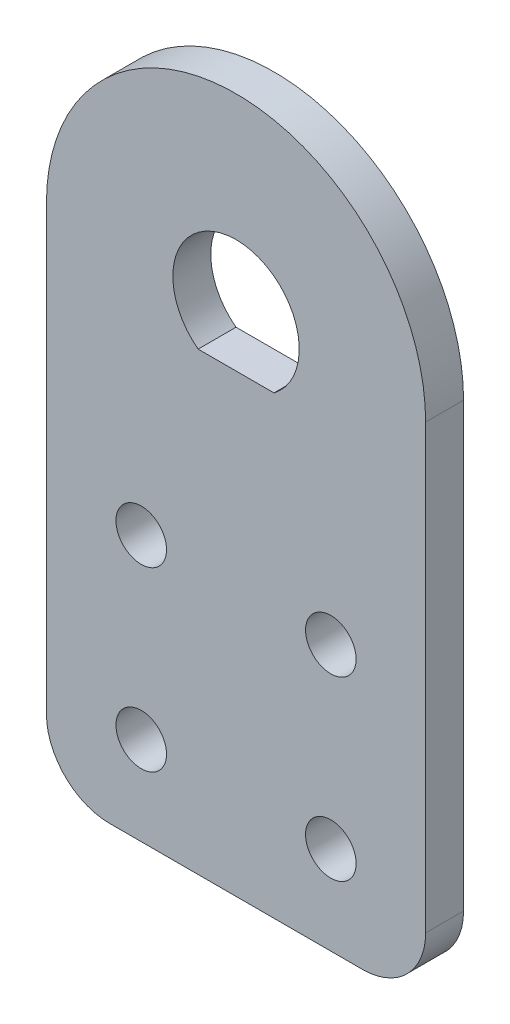
ISO-10303-21;
HEADER;
FILE_DESCRIPTION(('STEP AP214'),'2;1');
FILE_NAME('part.step','',(''),(''),'','','');
FILE_SCHEMA(('AUTOMOTIVE_DESIGN { 1 0 10303 214 1 1 1 1 }'));
ENDSEC;
DATA;
#1=APPLICATION_CONTEXT('core data for automotive mechanical design processes');
#2=APPLICATION_PROTOCOL_DEFINITION('international standard','automotive_design',2000,#1);
#3=PRODUCT_CONTEXT('',#1,'mechanical');
#4=PRODUCT('Part','Part','',(#3));
#5=PRODUCT_RELATED_PRODUCT_CATEGORY('part','',(#4));
#6=PRODUCT_DEFINITION_FORMATION('','',#4);
#7=PRODUCT_DEFINITION_CONTEXT('part definition',#1,'design');
#8=PRODUCT_DEFINITION('design','',#6,#7);
#9=PRODUCT_DEFINITION_SHAPE('','',#8);
#10=(LENGTH_UNIT() NAMED_UNIT(*) SI_UNIT(.MILLI.,.METRE.));
#11=(NAMED_UNIT(*) PLANE_ANGLE_UNIT() SI_UNIT($,.RADIAN.));
#12=(NAMED_UNIT(*) SI_UNIT($,.STERADIAN.) SOLID_ANGLE_UNIT());
#13=UNCERTAINTY_MEASURE_WITH_UNIT(LENGTH_MEASURE(1.E-05),#10,'distance_accuracy_value','');
#14=(GEOMETRIC_REPRESENTATION_CONTEXT(3) GLOBAL_UNCERTAINTY_ASSIGNED_CONTEXT((#13)) GLOBAL_UNIT_ASSIGNED_CONTEXT((#10,
#11,#12)) REPRESENTATION_CONTEXT('',''));
#15=CARTESIAN_POINT('',(0.,0.,0.));
#16=DIRECTION('',(0.,0.,1.));
#17=DIRECTION('',(1.,0.,0.));
#18=AXIS2_PLACEMENT_3D('',#15,#16,#17);
#19=CARTESIAN_POINT('',(0.,9.3667504192892,3.));
#20=DIRECTION('',(0.,0.,1.));
#21=DIRECTION('',(1.,0.,0.));
#22=AXIS2_PLACEMENT_3D('',#19,#20,#21);
#23=PLANE('',#22);
#24=CARTESIAN_POINT('',(7.5,-23.6332495807108,3.));
#25=DIRECTION('',(0.,0.,1.));
#26=DIRECTION('',(-1.,0.,0.));
#27=AXIS2_PLACEMENT_3D('',#24,#25,#26);
#28=CIRCLE('',#27,2.);
#29=CARTESIAN_POINT('',(5.5,-23.6332495807108,3.));
#30=VERTEX_POINT('',#29);
#31=EDGE_CURVE('E143',#30,#30,#28,.T.);
#32=ORIENTED_EDGE('',*,*,#31,.F.);
#33=EDGE_LOOP('',(#32));
#34=FACE_BOUND('',#33,.T.);
#35=CARTESIAN_POINT('',(-7.5,-9.6332495807108,3.));
#36=DIRECTION('',(0.,0.,1.));
#37=DIRECTION('',(1.,0.,0.));
#38=AXIS2_PLACEMENT_3D('',#35,#36,#37);
#39=CIRCLE('',#38,2.);
#40=CARTESIAN_POINT('',(-5.5,-9.6332495807108,3.));
#41=VERTEX_POINT('',#40);
#42=EDGE_CURVE('E159',#41,#41,#39,.T.);
#43=ORIENTED_EDGE('',*,*,#42,.F.);
#44=EDGE_LOOP('',(#43));
#45=FACE_BOUND('',#44,.T.);
#46=DIRECTION('',(1.,0.,0.));
#47=VECTOR('',#46,1.);
#48=CARTESIAN_POINT('',(-15.,-30.6332495807108,3.));
#49=LINE('',#48,#47);
#50=CARTESIAN_POINT('',(-10.,-30.6332495807108,3.));
#51=VERTEX_POINT('',#50);
#52=CARTESIAN_POINT('',(10.,-30.6332495807108,3.));
#53=VERTEX_POINT('',#52);
#54=EDGE_CURVE('E175',#51,#53,#49,.T.);
#55=ORIENTED_EDGE('',*,*,#54,.T.);
#56=CARTESIAN_POINT('',(10.,-25.6332495807108,3.));
#57=DIRECTION('',(0.,0.,1.));
#58=DIRECTION('',(1.,0.,0.));
#59=AXIS2_PLACEMENT_3D('',#56,#57,#58);
#60=CIRCLE('',#59,5.);
#61=CARTESIAN_POINT('',(15.,-25.6332495807108,3.));
#62=VERTEX_POINT('',#61);
#63=EDGE_CURVE('E47',#53,#62,#60,.T.);
#64=ORIENTED_EDGE('',*,*,#63,.T.);
#65=DIRECTION('',(0.,1.,0.));
#66=VECTOR('',#65,1.);
#67=CARTESIAN_POINT('',(15.,-30.6332495807108,3.));
#68=LINE('',#67,#66);
#69=CARTESIAN_POINT('',(15.,9.3667504192892,3.));
#70=VERTEX_POINT('',#69);
#71=EDGE_CURVE('E178',#62,#70,#68,.T.);
#72=ORIENTED_EDGE('',*,*,#71,.T.);
#73=CARTESIAN_POINT('',(0.,9.3667504192892,3.));
#74=DIRECTION('',(0.,0.,1.));
#75=DIRECTION('',(1.,0.,0.));
#76=AXIS2_PLACEMENT_3D('',#73,#74,#75);
#77=CIRCLE('',#76,15.);
#78=CARTESIAN_POINT('',(-15.,9.3667504192892,3.));
#79=VERTEX_POINT('',#78);
#80=EDGE_CURVE('E167',#70,#79,#77,.T.);
#81=ORIENTED_EDGE('',*,*,#80,.T.);
#82=DIRECTION('',(0.,-1.,0.));
#83=VECTOR('',#82,1.);
#84=CARTESIAN_POINT('',(-15.,9.3667504192892,3.));
#85=LINE('',#84,#83);
#86=CARTESIAN_POINT('',(-15.,-25.6332495807108,3.));
#87=VERTEX_POINT('',#86);
#88=EDGE_CURVE('E171',#79,#87,#85,.T.);
#89=ORIENTED_EDGE('',*,*,#88,.T.);
#90=CARTESIAN_POINT('',(-10.,-25.6332495807108,3.));
#91=DIRECTION('',(0.,0.,1.));
#92=DIRECTION('',(1.,0.,0.));
#93=AXIS2_PLACEMENT_3D('',#90,#91,#92);
#94=CIRCLE('',#93,5.);
#95=EDGE_CURVE('E216',#87,#51,#94,.T.);
#96=ORIENTED_EDGE('',*,*,#95,.T.);
#97=EDGE_LOOP('',(#55,#64,#72,#81,#89,#96));
#98=FACE_BOUND('',#97,.T.);
#99=CARTESIAN_POINT('',(-7.5,-23.6332495807108,3.));
#100=DIRECTION('',(0.,0.,1.));
#101=DIRECTION('',(1.,0.,0.));
#102=AXIS2_PLACEMENT_3D('',#99,#100,#101);
#103=CIRCLE('',#102,2.);
#104=CARTESIAN_POINT('',(-5.5,-23.6332495807108,3.));
#105=VERTEX_POINT('',#104);
#106=EDGE_CURVE('E151',#105,#105,#103,.T.);
#107=ORIENTED_EDGE('',*,*,#106,.F.);
#108=EDGE_LOOP('',(#107));
#109=FACE_BOUND('',#108,.T.);
#110=CARTESIAN_POINT('',(7.5,-9.6332495807108,3.));
#111=DIRECTION('',(0.,0.,1.));
#112=DIRECTION('',(-1.,0.,0.));
#113=AXIS2_PLACEMENT_3D('',#110,#111,#112);
#114=CIRCLE('',#113,2.);
#115=CARTESIAN_POINT('',(5.5,-9.6332495807108,3.));
#116=VERTEX_POINT('',#115);
#117=EDGE_CURVE('E135',#116,#116,#114,.T.);
#118=ORIENTED_EDGE('',*,*,#117,.F.);
#119=EDGE_LOOP('',(#118));
#120=FACE_BOUND('',#119,.T.);
#121=DIRECTION('',(1.,0.,0.));
#122=VECTOR('',#121,1.);
#123=CARTESIAN_POINT('',(3.,5.3667504192892,3.));
#124=LINE('',#123,#122);
#125=CARTESIAN_POINT('',(-3.,5.3667504192892,3.));
#126=VERTEX_POINT('',#125);
#127=CARTESIAN_POINT('',(3.,5.3667504192892,3.));
#128=VERTEX_POINT('',#127);
#129=EDGE_CURVE('E105',#126,#128,#124,.T.);
#130=ORIENTED_EDGE('',*,*,#129,.F.);
#131=CARTESIAN_POINT('',(0.,9.3667504192892,3.));
#132=DIRECTION('',(0.,0.,1.));
#133=DIRECTION('',(1.,0.,0.));
#134=AXIS2_PLACEMENT_3D('',#131,#132,#133);
#135=CIRCLE('',#134,5.);
#136=EDGE_CURVE('E116',#128,#126,#135,.T.);
#137=ORIENTED_EDGE('',*,*,#136,.F.);
#138=EDGE_LOOP('',(#130,#137));
#139=FACE_BOUND('',#138,.T.);
#140=ADVANCED_FACE('F38',(#34,#45,#98,#109,#120,#139),#23,.T.);
#141=CARTESIAN_POINT('',(0.,9.3667504192892,0.));
#142=DIRECTION('',(0.,0.,1.));
#143=DIRECTION('',(1.,0.,0.));
#144=AXIS2_PLACEMENT_3D('',#141,#142,#143);
#145=PLANE('',#144);
#146=CARTESIAN_POINT('',(7.5,-9.6332495807108,0.));
#147=DIRECTION('',(0.,0.,1.));
#148=DIRECTION('',(-1.,0.,0.));
#149=AXIS2_PLACEMENT_3D('',#146,#147,#148);
#150=CIRCLE('',#149,2.);
#151=CARTESIAN_POINT('',(5.5,-9.6332495807108,0.));
#152=VERTEX_POINT('',#151);
#153=EDGE_CURVE('E134',#152,#152,#150,.T.);
#154=ORIENTED_EDGE('',*,*,#153,.T.);
#155=EDGE_LOOP('',(#154));
#156=FACE_BOUND('',#155,.T.);
#157=CARTESIAN_POINT('',(7.5,-23.6332495807108,0.));
#158=DIRECTION('',(0.,0.,1.));
#159=DIRECTION('',(-1.,0.,0.));
#160=AXIS2_PLACEMENT_3D('',#157,#158,#159);
#161=CIRCLE('',#160,2.);
#162=CARTESIAN_POINT('',(5.5,-23.6332495807108,0.));
#163=VERTEX_POINT('',#162);
#164=EDGE_CURVE('E139',#163,#163,#161,.T.);
#165=ORIENTED_EDGE('',*,*,#164,.T.);
#166=EDGE_LOOP('',(#165));
#167=FACE_BOUND('',#166,.T.);
#168=CARTESIAN_POINT('',(-7.5,-23.6332495807108,0.));
#169=DIRECTION('',(0.,0.,1.));
#170=DIRECTION('',(1.,0.,0.));
#171=AXIS2_PLACEMENT_3D('',#168,#169,#170);
#172=CIRCLE('',#171,2.);
#173=CARTESIAN_POINT('',(-5.5,-23.6332495807108,0.));
#174=VERTEX_POINT('',#173);
#175=EDGE_CURVE('E147',#174,#174,#172,.T.);
#176=ORIENTED_EDGE('',*,*,#175,.T.);
#177=EDGE_LOOP('',(#176));
#178=FACE_BOUND('',#177,.T.);
#179=CARTESIAN_POINT('',(-7.5,-9.6332495807108,0.));
#180=DIRECTION('',(0.,0.,1.));
#181=DIRECTION('',(1.,0.,0.));
#182=AXIS2_PLACEMENT_3D('',#179,#180,#181);
#183=CIRCLE('',#182,2.);
#184=CARTESIAN_POINT('',(-5.5,-9.6332495807108,0.));
#185=VERTEX_POINT('',#184);
#186=EDGE_CURVE('E155',#185,#185,#183,.T.);
#187=ORIENTED_EDGE('',*,*,#186,.T.);
#188=EDGE_LOOP('',(#187));
#189=FACE_BOUND('',#188,.T.);
#190=DIRECTION('',(0.,1.,0.));
#191=VECTOR('',#190,1.);
#192=CARTESIAN_POINT('',(15.,-30.6332495807108,0.));
#193=LINE('',#192,#191);
#194=CARTESIAN_POINT('',(15.,-25.6332495807108,0.));
#195=VERTEX_POINT('',#194);
#196=CARTESIAN_POINT('',(15.,9.3667504192892,0.));
#197=VERTEX_POINT('',#196);
#198=EDGE_CURVE('E172',#195,#197,#193,.T.);
#199=ORIENTED_EDGE('',*,*,#198,.F.);
#200=CARTESIAN_POINT('',(10.,-25.6332495807108,0.));
#201=DIRECTION('',(0.,0.,1.));
#202=DIRECTION('',(1.,0.,0.));
#203=AXIS2_PLACEMENT_3D('',#200,#201,#202);
#204=CIRCLE('',#203,5.);
#205=CARTESIAN_POINT('',(10.,-30.6332495807108,0.));
#206=VERTEX_POINT('',#205);
#207=EDGE_CURVE('E207',#195,#206,#204,.F.);
#208=ORIENTED_EDGE('',*,*,#207,.T.);
#209=DIRECTION('',(1.,0.,0.));
#210=VECTOR('',#209,1.);
#211=CARTESIAN_POINT('',(-15.,-30.6332495807108,0.));
#212=LINE('',#211,#210);
#213=CARTESIAN_POINT('',(-10.,-30.6332495807108,0.));
#214=VERTEX_POINT('',#213);
#215=EDGE_CURVE('E188',#214,#206,#212,.T.);
#216=ORIENTED_EDGE('',*,*,#215,.F.);
#217=CARTESIAN_POINT('',(-10.,-25.6332495807108,0.));
#218=DIRECTION('',(0.,0.,1.));
#219=DIRECTION('',(1.,0.,0.));
#220=AXIS2_PLACEMENT_3D('',#217,#218,#219);
#221=CIRCLE('',#220,5.);
#222=CARTESIAN_POINT('',(-15.,-25.6332495807108,0.));
#223=VERTEX_POINT('',#222);
#224=EDGE_CURVE('E204',#214,#223,#221,.F.);
#225=ORIENTED_EDGE('',*,*,#224,.T.);
#226=DIRECTION('',(0.,-1.,0.));
#227=VECTOR('',#226,1.);
#228=CARTESIAN_POINT('',(-15.,9.3667504192892,0.));
#229=LINE('',#228,#227);
#230=CARTESIAN_POINT('',(-15.,9.3667504192892,0.));
#231=VERTEX_POINT('',#230);
#232=EDGE_CURVE('E185',#231,#223,#229,.T.);
#233=ORIENTED_EDGE('',*,*,#232,.F.);
#234=CARTESIAN_POINT('',(0.,9.3667504192892,0.));
#235=DIRECTION('',(0.,0.,1.));
#236=DIRECTION('',(1.,0.,0.));
#237=AXIS2_PLACEMENT_3D('',#234,#235,#236);
#238=CIRCLE('',#237,15.);
#239=EDGE_CURVE('E163',#197,#231,#238,.T.);
#240=ORIENTED_EDGE('',*,*,#239,.F.);
#241=EDGE_LOOP('',(#199,#208,#216,#225,#233,#240));
#242=FACE_BOUND('',#241,.T.);
#243=CARTESIAN_POINT('',(0.,9.3667504192892,0.));
#244=DIRECTION('',(0.,0.,1.));
#245=DIRECTION('',(1.,0.,0.));
#246=AXIS2_PLACEMENT_3D('',#243,#244,#245);
#247=CIRCLE('',#246,5.);
#248=CARTESIAN_POINT('',(3.,5.3667504192892,0.));
#249=VERTEX_POINT('',#248);
#250=CARTESIAN_POINT('',(-3.,5.3667504192892,0.));
#251=VERTEX_POINT('',#250);
#252=EDGE_CURVE('E121',#249,#251,#247,.T.);
#253=ORIENTED_EDGE('',*,*,#252,.T.);
#254=DIRECTION('',(1.,0.,0.));
#255=VECTOR('',#254,1.);
#256=CARTESIAN_POINT('',(3.,5.3667504192892,0.));
#257=LINE('',#256,#255);
#258=EDGE_CURVE('E125',#251,#249,#257,.T.);
#259=ORIENTED_EDGE('',*,*,#258,.T.);
#260=EDGE_LOOP('',(#253,#259));
#261=FACE_BOUND('',#260,.T.);
#262=ADVANCED_FACE('F233',(#156,#167,#178,#189,#242,#261),#145,.F.);
#263=CARTESIAN_POINT('',(0.,9.3667504192892,3.));
#264=DIRECTION('',(0.,0.,-1.));
#265=DIRECTION('',(-1.,0.,0.));
#266=AXIS2_PLACEMENT_3D('',#263,#264,#265);
#267=CYLINDRICAL_SURFACE('',#266,15.);
#268=ORIENTED_EDGE('',*,*,#239,.T.);
#269=DIRECTION('',(0.,0.,-1.));
#270=VECTOR('',#269,1.);
#271=CARTESIAN_POINT('',(-15.,9.3667504192892,3.));
#272=LINE('',#271,#270);
#273=EDGE_CURVE('E196',#79,#231,#272,.T.);
#274=ORIENTED_EDGE('',*,*,#273,.F.);
#275=ORIENTED_EDGE('',*,*,#80,.F.);
#276=DIRECTION('',(0.,0.,-1.));
#277=VECTOR('',#276,1.);
#278=CARTESIAN_POINT('',(15.,9.3667504192892,3.));
#279=LINE('',#278,#277);
#280=EDGE_CURVE('E181',#70,#197,#279,.T.);
#281=ORIENTED_EDGE('',*,*,#280,.T.);
#282=EDGE_LOOP('',(#268,#274,#275,#281));
#283=FACE_BOUND('',#282,.T.);
#284=ADVANCED_FACE('F243',(#283),#267,.T.);
#285=CARTESIAN_POINT('',(-15.,9.3667504192892,3.));
#286=DIRECTION('',(1.,0.,0.));
#287=DIRECTION('',(0.,0.,-1.));
#288=AXIS2_PLACEMENT_3D('',#285,#286,#287);
#289=PLANE('',#288);
#290=ORIENTED_EDGE('',*,*,#232,.T.);
#291=DIRECTION('',(0.,0.,-1.));
#292=VECTOR('',#291,1.);
#293=CARTESIAN_POINT('',(-15.,-25.6332495807108,3.));
#294=LINE('',#293,#292);
#295=EDGE_CURVE('E11',#223,#87,#294,.F.);
#296=ORIENTED_EDGE('',*,*,#295,.T.);
#297=ORIENTED_EDGE('',*,*,#88,.F.);
#298=ORIENTED_EDGE('',*,*,#273,.T.);
#299=EDGE_LOOP('',(#290,#296,#297,#298));
#300=FACE_BOUND('',#299,.T.);
#301=ADVANCED_FACE('F240',(#300),#289,.F.);
#302=CARTESIAN_POINT('',(-15.,-30.6332495807108,3.));
#303=DIRECTION('',(0.,1.,0.));
#304=DIRECTION('',(0.,0.,1.));
#305=AXIS2_PLACEMENT_3D('',#302,#303,#304);
#306=PLANE('',#305);
#307=ORIENTED_EDGE('',*,*,#215,.T.);
#308=DIRECTION('',(0.,0.,-1.));
#309=VECTOR('',#308,1.);
#310=CARTESIAN_POINT('',(10.,-30.6332495807108,3.));
#311=LINE('',#310,#309);
#312=EDGE_CURVE('E60',#206,#53,#311,.F.);
#313=ORIENTED_EDGE('',*,*,#312,.T.);
#314=ORIENTED_EDGE('',*,*,#54,.F.);
#315=DIRECTION('',(0.,0.,-1.));
#316=VECTOR('',#315,1.);
#317=CARTESIAN_POINT('',(-10.,-30.6332495807108,3.));
#318=LINE('',#317,#316);
#319=EDGE_CURVE('E210',#51,#214,#318,.T.);
#320=ORIENTED_EDGE('',*,*,#319,.T.);
#321=EDGE_LOOP('',(#307,#313,#314,#320));
#322=FACE_BOUND('',#321,.T.);
#323=ADVANCED_FACE('F236',(#322),#306,.F.);
#324=CARTESIAN_POINT('',(15.,-30.6332495807108,3.));
#325=DIRECTION('',(-1.,0.,0.));
#326=DIRECTION('',(0.,0.,1.));
#327=AXIS2_PLACEMENT_3D('',#324,#325,#326);
#328=PLANE('',#327);
#329=ORIENTED_EDGE('',*,*,#71,.F.);
#330=DIRECTION('',(0.,0.,-1.));
#331=VECTOR('',#330,1.);
#332=CARTESIAN_POINT('',(15.,-25.6332495807108,3.));
#333=LINE('',#332,#331);
#334=EDGE_CURVE('E200',#62,#195,#333,.T.);
#335=ORIENTED_EDGE('',*,*,#334,.T.);
#336=ORIENTED_EDGE('',*,*,#198,.T.);
#337=ORIENTED_EDGE('',*,*,#280,.F.);
#338=EDGE_LOOP('',(#329,#335,#336,#337));
#339=FACE_BOUND('',#338,.T.);
#340=ADVANCED_FACE('F227',(#339),#328,.F.);
#341=CARTESIAN_POINT('',(-7.5,-9.6332495807108,3.));
#342=DIRECTION('',(0.,0.,-1.));
#343=DIRECTION('',(-1.,0.,0.));
#344=AXIS2_PLACEMENT_3D('',#341,#342,#343);
#345=CYLINDRICAL_SURFACE('',#344,2.);
#346=ORIENTED_EDGE('',*,*,#42,.T.);
#347=EDGE_LOOP('',(#346));
#348=FACE_BOUND('',#347,.T.);
#349=ORIENTED_EDGE('',*,*,#186,.F.);
#350=EDGE_LOOP('',(#349));
#351=FACE_BOUND('',#350,.T.);
#352=ADVANCED_FACE('F264',(#348,#351),#345,.F.);
#353=CARTESIAN_POINT('',(-7.5,-23.6332495807108,3.));
#354=DIRECTION('',(0.,0.,-1.));
#355=DIRECTION('',(-1.,0.,0.));
#356=AXIS2_PLACEMENT_3D('',#353,#354,#355);
#357=CYLINDRICAL_SURFACE('',#356,2.);
#358=ORIENTED_EDGE('',*,*,#106,.T.);
#359=EDGE_LOOP('',(#358));
#360=FACE_BOUND('',#359,.T.);
#361=ORIENTED_EDGE('',*,*,#175,.F.);
#362=EDGE_LOOP('',(#361));
#363=FACE_BOUND('',#362,.T.);
#364=ADVANCED_FACE('F318',(#360,#363),#357,.F.);
#365=CARTESIAN_POINT('',(7.5,-23.6332495807108,3.));
#366=DIRECTION('',(0.,0.,-1.));
#367=DIRECTION('',(-1.,0.,0.));
#368=AXIS2_PLACEMENT_3D('',#365,#366,#367);
#369=CYLINDRICAL_SURFACE('',#368,2.);
#370=ORIENTED_EDGE('',*,*,#31,.T.);
#371=EDGE_LOOP('',(#370));
#372=FACE_BOUND('',#371,.T.);
#373=ORIENTED_EDGE('',*,*,#164,.F.);
#374=EDGE_LOOP('',(#373));
#375=FACE_BOUND('',#374,.T.);
#376=ADVANCED_FACE('F310',(#372,#375),#369,.F.);
#377=CARTESIAN_POINT('',(7.5,-9.6332495807108,3.));
#378=DIRECTION('',(0.,0.,-1.));
#379=DIRECTION('',(-1.,0.,0.));
#380=AXIS2_PLACEMENT_3D('',#377,#378,#379);
#381=CYLINDRICAL_SURFACE('',#380,2.);
#382=ORIENTED_EDGE('',*,*,#117,.T.);
#383=EDGE_LOOP('',(#382));
#384=FACE_BOUND('',#383,.T.);
#385=ORIENTED_EDGE('',*,*,#153,.F.);
#386=EDGE_LOOP('',(#385));
#387=FACE_BOUND('',#386,.T.);
#388=ADVANCED_FACE('F303',(#384,#387),#381,.F.);
#389=CARTESIAN_POINT('',(0.,9.3667504192892,3.));
#390=DIRECTION('',(0.,0.,-1.));
#391=DIRECTION('',(-1.,0.,0.));
#392=AXIS2_PLACEMENT_3D('',#389,#390,#391);
#393=CYLINDRICAL_SURFACE('',#392,5.);
#394=ORIENTED_EDGE('',*,*,#252,.F.);
#395=DIRECTION('',(0.,0.,-1.));
#396=VECTOR('',#395,1.);
#397=CARTESIAN_POINT('',(3.,5.3667504192892,3.));
#398=LINE('',#397,#396);
#399=EDGE_CURVE('E108',#128,#249,#398,.T.);
#400=ORIENTED_EDGE('',*,*,#399,.F.);
#401=ORIENTED_EDGE('',*,*,#136,.T.);
#402=DIRECTION('',(0.,0.,-1.));
#403=VECTOR('',#402,1.);
#404=CARTESIAN_POINT('',(-3.,5.3667504192892,3.));
#405=LINE('',#404,#403);
#406=EDGE_CURVE('E111',#126,#251,#405,.T.);
#407=ORIENTED_EDGE('',*,*,#406,.T.);
#408=EDGE_LOOP('',(#394,#400,#401,#407));
#409=FACE_BOUND('',#408,.T.);
#410=ADVANCED_FACE('F119',(#409),#393,.F.);
#411=CARTESIAN_POINT('',(3.,5.3667504192892,3.));
#412=DIRECTION('',(0.,1.,0.));
#413=DIRECTION('',(0.,0.,1.));
#414=AXIS2_PLACEMENT_3D('',#411,#412,#413);
#415=PLANE('',#414);
#416=ORIENTED_EDGE('',*,*,#258,.F.);
#417=ORIENTED_EDGE('',*,*,#406,.F.);
#418=ORIENTED_EDGE('',*,*,#129,.T.);
#419=ORIENTED_EDGE('',*,*,#399,.T.);
#420=EDGE_LOOP('',(#416,#417,#418,#419));
#421=FACE_BOUND('',#420,.T.);
#422=ADVANCED_FACE('F107',(#421),#415,.T.);
#423=CARTESIAN_POINT('',(10.,-25.6332495807108,3.));
#424=DIRECTION('',(0.,0.,-1.));
#425=DIRECTION('',(-1.,0.,0.));
#426=AXIS2_PLACEMENT_3D('',#423,#424,#425);
#427=CYLINDRICAL_SURFACE('',#426,5.);
#428=ORIENTED_EDGE('',*,*,#63,.F.);
#429=ORIENTED_EDGE('',*,*,#312,.F.);
#430=ORIENTED_EDGE('',*,*,#207,.F.);
#431=ORIENTED_EDGE('',*,*,#334,.F.);
#432=EDGE_LOOP('',(#428,#429,#430,#431));
#433=FACE_BOUND('',#432,.T.);
#434=ADVANCED_FACE('F230',(#433),#427,.T.);
#435=CARTESIAN_POINT('',(-10.,-25.6332495807108,3.));
#436=DIRECTION('',(0.,0.,-1.));
#437=DIRECTION('',(-1.,0.,0.));
#438=AXIS2_PLACEMENT_3D('',#435,#436,#437);
#439=CYLINDRICAL_SURFACE('',#438,5.);
#440=ORIENTED_EDGE('',*,*,#95,.F.);
#441=ORIENTED_EDGE('',*,*,#295,.F.);
#442=ORIENTED_EDGE('',*,*,#224,.F.);
#443=ORIENTED_EDGE('',*,*,#319,.F.);
#444=EDGE_LOOP('',(#440,#441,#442,#443));
#445=FACE_BOUND('',#444,.T.);
#446=ADVANCED_FACE('F40',(#445),#439,.T.);
#447=CLOSED_SHELL('',(#140,#262,#284,#301,#323,#340,#352,#364,#376,#388,#410,#422,#434,#446));
#448=MANIFOLD_SOLID_BREP('B2',#447);
#449=ADVANCED_BREP_SHAPE_REPRESENTATION('',(#18,#448),#14);
#450=SHAPE_DEFINITION_REPRESENTATION(#9,#449);
ENDSEC;
END-ISO-10303-21;
